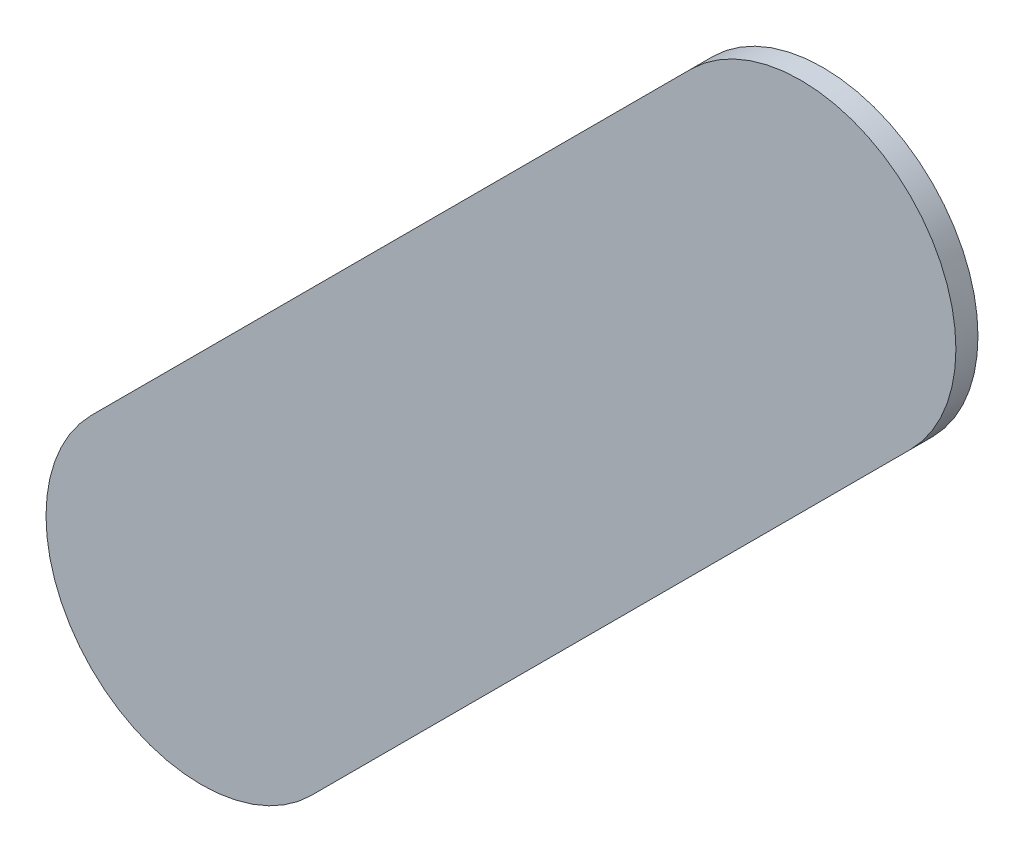
ISO-10303-21;
HEADER;
FILE_DESCRIPTION(('STEP AP214'),'2;1');
FILE_NAME('part.step','',(''),(''),'','','');
FILE_SCHEMA(('AUTOMOTIVE_DESIGN { 1 0 10303 214 1 1 1 1 }'));
ENDSEC;
DATA;
#1=APPLICATION_CONTEXT('core data for automotive mechanical design processes');
#2=APPLICATION_PROTOCOL_DEFINITION('international standard','automotive_design',2000,#1);
#3=PRODUCT_CONTEXT('',#1,'mechanical');
#4=PRODUCT('Part','Part','',(#3));
#5=PRODUCT_RELATED_PRODUCT_CATEGORY('part','',(#4));
#6=PRODUCT_DEFINITION_FORMATION('','',#4);
#7=PRODUCT_DEFINITION_CONTEXT('part definition',#1,'design');
#8=PRODUCT_DEFINITION('design','',#6,#7);
#9=PRODUCT_DEFINITION_SHAPE('','',#8);
#10=(LENGTH_UNIT() NAMED_UNIT(*) SI_UNIT(.MILLI.,.METRE.));
#11=(NAMED_UNIT(*) PLANE_ANGLE_UNIT() SI_UNIT($,.RADIAN.));
#12=(NAMED_UNIT(*) SI_UNIT($,.STERADIAN.) SOLID_ANGLE_UNIT());
#13=UNCERTAINTY_MEASURE_WITH_UNIT(LENGTH_MEASURE(1.E-05),#10,'distance_accuracy_value','');
#14=(GEOMETRIC_REPRESENTATION_CONTEXT(3) GLOBAL_UNCERTAINTY_ASSIGNED_CONTEXT((#13)) GLOBAL_UNIT_ASSIGNED_CONTEXT((#10,
#11,#12)) REPRESENTATION_CONTEXT('',''));
#15=CARTESIAN_POINT('',(0.,0.,0.));
#16=DIRECTION('',(0.,0.,1.));
#17=DIRECTION('',(1.,0.,0.));
#18=AXIS2_PLACEMENT_3D('',#15,#16,#17);
#19=CARTESIAN_POINT('',(48.5767761,92.50680762,0.));
#20=DIRECTION('',(-0.707106781186545,0.70710678118655,0.));
#21=DIRECTION('',(0.70710678118655,0.707106781186545,0.));
#22=AXIS2_PLACEMENT_3D('',#19,#20,#21);
#23=PLANE('',#22);
#24=DIRECTION('',(0.70710678118655,0.707106781186545,0.));
#25=VECTOR('',#24,1.);
#26=CARTESIAN_POINT('',(48.5767761,92.50680762,0.03556));
#27=LINE('',#26,#25);
#28=CARTESIAN_POINT('',(48.5767761,92.50680762,0.03556));
#29=VERTEX_POINT('',#28);
#30=CARTESIAN_POINT('',(49.54178052,93.47181204,0.03556));
#31=VERTEX_POINT('',#30);
#32=EDGE_CURVE('E11',#29,#31,#27,.T.);
#33=ORIENTED_EDGE('',*,*,#32,.F.);
#34=DIRECTION('',(0.,0.,1.));
#35=VECTOR('',#34,1.);
#36=CARTESIAN_POINT('',(48.5767761,92.50680762,0.));
#37=LINE('',#36,#35);
#38=CARTESIAN_POINT('',(48.5767761,92.50680762,0.));
#39=VERTEX_POINT('',#38);
#40=EDGE_CURVE('E24',#39,#29,#37,.T.);
#41=ORIENTED_EDGE('',*,*,#40,.F.);
#42=DIRECTION('',(0.70710678118655,0.707106781186545,0.));
#43=VECTOR('',#42,1.);
#44=CARTESIAN_POINT('',(48.5767761,92.50680762,0.));
#45=LINE('',#44,#43);
#46=CARTESIAN_POINT('',(49.54178052,93.47181204,0.));
#47=VERTEX_POINT('',#46);
#48=EDGE_CURVE('E75',#39,#47,#45,.T.);
#49=ORIENTED_EDGE('',*,*,#48,.T.);
#50=DIRECTION('',(0.,0.,1.));
#51=VECTOR('',#50,1.);
#52=CARTESIAN_POINT('',(49.54178052,93.47181204,0.));
#53=LINE('',#52,#51);
#54=EDGE_CURVE('E37',#47,#31,#53,.T.);
#55=ORIENTED_EDGE('',*,*,#54,.T.);
#56=EDGE_LOOP('',(#33,#41,#49,#55));
#57=FACE_BOUND('',#56,.T.);
#58=ADVANCED_FACE('F17',(#57),#23,.F.);
#59=CARTESIAN_POINT('',(49.36500414,93.64858842,0.));
#60=DIRECTION('',(0.,0.,-1.));
#61=DIRECTION('',(0.707106781186576,-0.707106781186519,0.));
#62=AXIS2_PLACEMENT_3D('',#59,#60,#61);
#63=CYLINDRICAL_SURFACE('',#62,0.249999554103218);
#64=CARTESIAN_POINT('',(49.36500414,93.64858842,0.03556));
#65=DIRECTION('',(0.,0.,1.));
#66=DIRECTION('',(0.707106781186576,-0.707106781186519,0.));
#67=AXIS2_PLACEMENT_3D('',#64,#65,#66);
#68=CIRCLE('',#67,0.249999554103218);
#69=CARTESIAN_POINT('',(49.18822776,93.8253648,0.03556));
#70=VERTEX_POINT('',#69);
#71=EDGE_CURVE('E83',#31,#70,#68,.T.);
#72=ORIENTED_EDGE('',*,*,#71,.F.);
#73=ORIENTED_EDGE('',*,*,#54,.F.);
#74=CARTESIAN_POINT('',(49.36500414,93.64858842,0.));
#75=DIRECTION('',(0.,0.,1.));
#76=DIRECTION('',(0.707106781186576,-0.707106781186519,0.));
#77=AXIS2_PLACEMENT_3D('',#74,#75,#76);
#78=CIRCLE('',#77,0.249999554103218);
#79=CARTESIAN_POINT('',(49.18822776,93.8253648,0.));
#80=VERTEX_POINT('',#79);
#81=EDGE_CURVE('E81',#47,#80,#78,.T.);
#82=ORIENTED_EDGE('',*,*,#81,.T.);
#83=DIRECTION('',(0.,0.,1.));
#84=VECTOR('',#83,1.);
#85=CARTESIAN_POINT('',(49.18822776,93.8253648,0.));
#86=LINE('',#85,#84);
#87=EDGE_CURVE('E67',#80,#70,#86,.T.);
#88=ORIENTED_EDGE('',*,*,#87,.T.);
#89=EDGE_LOOP('',(#72,#73,#82,#88));
#90=FACE_BOUND('',#89,.T.);
#91=ADVANCED_FACE('F89',(#90),#63,.T.);
#92=CARTESIAN_POINT('',(49.18822776,93.8253648,0.));
#93=DIRECTION('',(0.707106781186548,-0.707106781186548,0.));
#94=DIRECTION('',(-0.707106781186548,-0.707106781186548,0.));
#95=AXIS2_PLACEMENT_3D('',#92,#93,#94);
#96=PLANE('',#95);
#97=DIRECTION('',(-0.707106781186548,-0.707106781186548,0.));
#98=VECTOR('',#97,1.);
#99=CARTESIAN_POINT('',(49.18822776,93.8253648,0.03556));
#100=LINE('',#99,#98);
#101=CARTESIAN_POINT('',(48.22322334,92.86036038,0.03556));
#102=VERTEX_POINT('',#101);
#103=EDGE_CURVE('E71',#70,#102,#100,.T.);
#104=ORIENTED_EDGE('',*,*,#103,.F.);
#105=ORIENTED_EDGE('',*,*,#87,.F.);
#106=DIRECTION('',(-0.707106781186548,-0.707106781186548,0.));
#107=VECTOR('',#106,1.);
#108=CARTESIAN_POINT('',(49.18822776,93.8253648,0.));
#109=LINE('',#108,#107);
#110=CARTESIAN_POINT('',(48.22322334,92.86036038,0.));
#111=VERTEX_POINT('',#110);
#112=EDGE_CURVE('E63',#80,#111,#109,.T.);
#113=ORIENTED_EDGE('',*,*,#112,.T.);
#114=DIRECTION('',(0.,0.,1.));
#115=VECTOR('',#114,1.);
#116=CARTESIAN_POINT('',(48.22322334,92.86036038,0.));
#117=LINE('',#116,#115);
#118=EDGE_CURVE('E53',#111,#102,#117,.T.);
#119=ORIENTED_EDGE('',*,*,#118,.T.);
#120=EDGE_LOOP('',(#104,#105,#113,#119));
#121=FACE_BOUND('',#120,.T.);
#122=ADVANCED_FACE('F66',(#121),#96,.F.);
#123=CARTESIAN_POINT('',(48.39999972,92.683584,0.));
#124=DIRECTION('',(0.,0.,-1.));
#125=DIRECTION('',(-0.707106781186562,0.707106781186533,0.));
#126=AXIS2_PLACEMENT_3D('',#123,#124,#125);
#127=CYLINDRICAL_SURFACE('',#126,0.249999554103215);
#128=CARTESIAN_POINT('',(48.39999972,92.683584,0.03556));
#129=DIRECTION('',(0.,0.,1.));
#130=DIRECTION('',(-0.707106781186562,0.707106781186533,0.));
#131=AXIS2_PLACEMENT_3D('',#128,#129,#130);
#132=CIRCLE('',#131,0.249999554103215);
#133=EDGE_CURVE('E59',#102,#29,#132,.T.);
#134=ORIENTED_EDGE('',*,*,#133,.F.);
#135=ORIENTED_EDGE('',*,*,#118,.F.);
#136=CARTESIAN_POINT('',(48.39999972,92.683584,0.));
#137=DIRECTION('',(0.,0.,1.));
#138=DIRECTION('',(-0.707106781186562,0.707106781186533,0.));
#139=AXIS2_PLACEMENT_3D('',#136,#137,#138);
#140=CIRCLE('',#139,0.249999554103215);
#141=EDGE_CURVE('E57',#111,#39,#140,.T.);
#142=ORIENTED_EDGE('',*,*,#141,.T.);
#143=ORIENTED_EDGE('',*,*,#40,.T.);
#144=EDGE_LOOP('',(#134,#135,#142,#143));
#145=FACE_BOUND('',#144,.T.);
#146=ADVANCED_FACE('F55',(#145),#127,.T.);
#147=CARTESIAN_POINT('',(48.5767761,92.50680762,0.));
#148=DIRECTION('',(0.,0.,-1.));
#149=DIRECTION('',(-1.,0.,0.));
#150=AXIS2_PLACEMENT_3D('',#147,#148,#149);
#151=PLANE('',#150);
#152=ORIENTED_EDGE('',*,*,#141,.F.);
#153=ORIENTED_EDGE('',*,*,#112,.F.);
#154=ORIENTED_EDGE('',*,*,#81,.F.);
#155=ORIENTED_EDGE('',*,*,#48,.F.);
#156=EDGE_LOOP('',(#152,#153,#154,#155));
#157=FACE_BOUND('',#156,.T.);
#158=ADVANCED_FACE('F74',(#157),#151,.T.);
#159=CARTESIAN_POINT('',(48.5767761,92.50680762,0.03556));
#160=DIRECTION('',(0.,0.,-1.));
#161=DIRECTION('',(-1.,0.,0.));
#162=AXIS2_PLACEMENT_3D('',#159,#160,#161);
#163=PLANE('',#162);
#164=ORIENTED_EDGE('',*,*,#32,.T.);
#165=ORIENTED_EDGE('',*,*,#71,.T.);
#166=ORIENTED_EDGE('',*,*,#103,.T.);
#167=ORIENTED_EDGE('',*,*,#133,.T.);
#168=EDGE_LOOP('',(#164,#165,#166,#167));
#169=FACE_BOUND('',#168,.T.);
#170=ADVANCED_FACE('F91',(#169),#163,.F.);
#171=CLOSED_SHELL('',(#58,#91,#122,#146,#158,#170));
#172=MANIFOLD_SOLID_BREP('B1',#171);
#173=ADVANCED_BREP_SHAPE_REPRESENTATION('',(#18,#172),#14);
#174=SHAPE_DEFINITION_REPRESENTATION(#9,#173);
ENDSEC;
END-ISO-10303-21;
